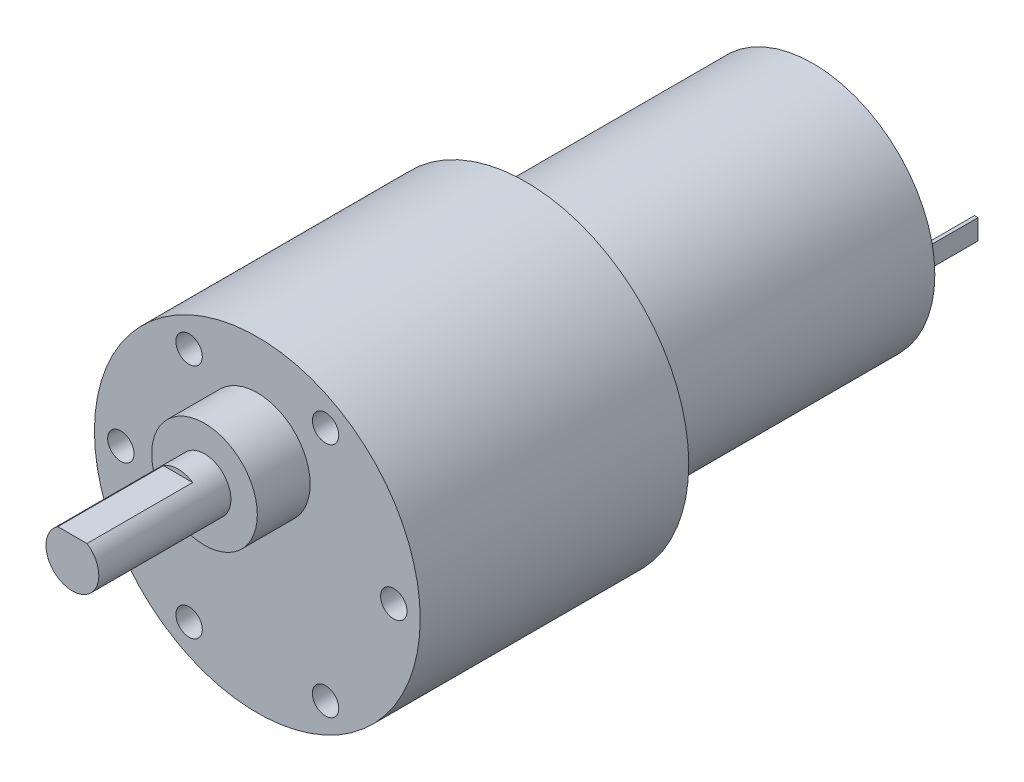
ISO-10303-21;
HEADER;
FILE_DESCRIPTION(('STEP AP214'),'2;1');
FILE_NAME('part.step','',(''),(''),'','','');
FILE_SCHEMA(('AUTOMOTIVE_DESIGN { 1 0 10303 214 1 1 1 1 }'));
ENDSEC;
DATA;
#1=APPLICATION_CONTEXT('core data for automotive mechanical design processes');
#2=APPLICATION_PROTOCOL_DEFINITION('international standard','automotive_design',2000,#1);
#3=PRODUCT_CONTEXT('',#1,'mechanical');
#4=PRODUCT('Part','Part','',(#3));
#5=PRODUCT_RELATED_PRODUCT_CATEGORY('part','',(#4));
#6=PRODUCT_DEFINITION_FORMATION('','',#4);
#7=PRODUCT_DEFINITION_CONTEXT('part definition',#1,'design');
#8=PRODUCT_DEFINITION('design','',#6,#7);
#9=PRODUCT_DEFINITION_SHAPE('','',#8);
#10=(LENGTH_UNIT() NAMED_UNIT(*) SI_UNIT(.MILLI.,.METRE.));
#11=(NAMED_UNIT(*) PLANE_ANGLE_UNIT() SI_UNIT($,.RADIAN.));
#12=(NAMED_UNIT(*) SI_UNIT($,.STERADIAN.) SOLID_ANGLE_UNIT());
#13=UNCERTAINTY_MEASURE_WITH_UNIT(LENGTH_MEASURE(1.E-05),#10,'distance_accuracy_value','');
#14=(GEOMETRIC_REPRESENTATION_CONTEXT(3) GLOBAL_UNCERTAINTY_ASSIGNED_CONTEXT((#13)) GLOBAL_UNIT_ASSIGNED_CONTEXT((#10,
#11,#12)) REPRESENTATION_CONTEXT('',''));
#15=CARTESIAN_POINT('',(0.,0.,0.));
#16=DIRECTION('',(0.,0.,1.));
#17=DIRECTION('',(1.,0.,0.));
#18=AXIS2_PLACEMENT_3D('',#15,#16,#17);
#19=CARTESIAN_POINT('',(0.,0.,0.));
#20=DIRECTION('',(0.,0.,1.));
#21=DIRECTION('',(1.,0.,0.));
#22=AXIS2_PLACEMENT_3D('',#19,#20,#21);
#23=PLANE('',#22);
#24=DIRECTION('',(0.,-1.,0.));
#25=VECTOR('',#24,1.);
#26=CARTESIAN_POINT('',(11.85,1.15,0.));
#27=LINE('',#26,#25);
#28=CARTESIAN_POINT('',(11.85,1.15,0.));
#29=VERTEX_POINT('',#28);
#30=CARTESIAN_POINT('',(11.85,-1.15,0.));
#31=VERTEX_POINT('',#30);
#32=EDGE_CURVE('E132',#29,#31,#27,.T.);
#33=ORIENTED_EDGE('',*,*,#32,.F.);
#34=DIRECTION('',(1.,0.,0.));
#35=VECTOR('',#34,1.);
#36=CARTESIAN_POINT('',(11.85,1.15,0.));
#37=LINE('',#36,#35);
#38=CARTESIAN_POINT('',(11.45,1.15,0.));
#39=VERTEX_POINT('',#38);
#40=EDGE_CURVE('E145',#39,#29,#37,.T.);
#41=ORIENTED_EDGE('',*,*,#40,.F.);
#42=DIRECTION('',(0.,1.,0.));
#43=VECTOR('',#42,1.);
#44=CARTESIAN_POINT('',(11.45,1.15,0.));
#45=LINE('',#44,#43);
#46=CARTESIAN_POINT('',(11.45,-1.15,0.));
#47=VERTEX_POINT('',#46);
#48=EDGE_CURVE('E154',#47,#39,#45,.T.);
#49=ORIENTED_EDGE('',*,*,#48,.F.);
#50=DIRECTION('',(-1.,0.,0.));
#51=VECTOR('',#50,1.);
#52=CARTESIAN_POINT('',(11.85,-1.15,0.));
#53=LINE('',#52,#51);
#54=EDGE_CURVE('E135',#31,#47,#53,.T.);
#55=ORIENTED_EDGE('',*,*,#54,.F.);
#56=EDGE_LOOP('',(#33,#41,#49,#55));
#57=FACE_BOUND('',#56,.T.);
#58=CARTESIAN_POINT('',(0.,0.,0.));
#59=DIRECTION('',(0.,0.,-1.));
#60=DIRECTION('',(-1.,0.,0.));
#61=AXIS2_PLACEMENT_3D('',#58,#59,#60);
#62=CIRCLE('',#61,5.);
#63=CARTESIAN_POINT('',(-5.,0.,0.));
#64=VERTEX_POINT('',#63);
#65=EDGE_CURVE('E42',#64,#64,#62,.T.);
#66=ORIENTED_EDGE('',*,*,#65,.F.);
#67=EDGE_LOOP('',(#66));
#68=FACE_BOUND('',#67,.T.);
#69=CARTESIAN_POINT('',(0.,0.,0.));
#70=DIRECTION('',(0.,0.,1.));
#71=DIRECTION('',(1.,0.,0.));
#72=AXIS2_PLACEMENT_3D('',#69,#70,#71);
#73=CIRCLE('',#72,13.85);
#74=CARTESIAN_POINT('',(13.85,0.,0.));
#75=VERTEX_POINT('',#74);
#76=EDGE_CURVE('E243',#75,#75,#73,.T.);
#77=ORIENTED_EDGE('',*,*,#76,.F.);
#78=EDGE_LOOP('',(#77));
#79=FACE_BOUND('',#78,.T.);
#80=DIRECTION('',(0.,1.,0.));
#81=VECTOR('',#80,1.);
#82=CARTESIAN_POINT('',(-11.85,1.15,0.));
#83=LINE('',#82,#81);
#84=CARTESIAN_POINT('',(-11.85,-1.15,0.));
#85=VERTEX_POINT('',#84);
#86=CARTESIAN_POINT('',(-11.85,1.15,0.));
#87=VERTEX_POINT('',#86);
#88=EDGE_CURVE('E131',#85,#87,#83,.T.);
#89=ORIENTED_EDGE('',*,*,#88,.F.);
#90=DIRECTION('',(-1.,0.,0.));
#91=VECTOR('',#90,1.);
#92=CARTESIAN_POINT('',(-11.85,-1.15,0.));
#93=LINE('',#92,#91);
#94=CARTESIAN_POINT('',(-11.45,-1.15,0.));
#95=VERTEX_POINT('',#94);
#96=EDGE_CURVE('E128',#95,#85,#93,.T.);
#97=ORIENTED_EDGE('',*,*,#96,.F.);
#98=DIRECTION('',(0.,-1.,0.));
#99=VECTOR('',#98,1.);
#100=CARTESIAN_POINT('',(-11.45,1.15,0.));
#101=LINE('',#100,#99);
#102=CARTESIAN_POINT('',(-11.45,1.15,0.));
#103=VERTEX_POINT('',#102);
#104=EDGE_CURVE('E54',#103,#95,#101,.T.);
#105=ORIENTED_EDGE('',*,*,#104,.F.);
#106=DIRECTION('',(1.,0.,0.));
#107=VECTOR('',#106,1.);
#108=CARTESIAN_POINT('',(-11.85,1.15,0.));
#109=LINE('',#108,#107);
#110=EDGE_CURVE('E49',#87,#103,#109,.T.);
#111=ORIENTED_EDGE('',*,*,#110,.F.);
#112=EDGE_LOOP('',(#89,#97,#105,#111));
#113=FACE_BOUND('',#112,.T.);
#114=ADVANCED_FACE('F34',(#57,#68,#79,#113),#23,.F.);
#115=CARTESIAN_POINT('',(0.,0.,32.6));
#116=DIRECTION('',(0.,0.,-1.));
#117=DIRECTION('',(-1.,0.,0.));
#118=AXIS2_PLACEMENT_3D('',#115,#116,#117);
#119=CYLINDRICAL_SURFACE('',#118,13.85);
#120=CARTESIAN_POINT('',(0.,0.,32.6));
#121=DIRECTION('',(0.,0.,1.));
#122=DIRECTION('',(1.,0.,0.));
#123=AXIS2_PLACEMENT_3D('',#120,#121,#122);
#124=CIRCLE('',#123,13.85);
#125=CARTESIAN_POINT('',(13.85,0.,32.6));
#126=VERTEX_POINT('',#125);
#127=EDGE_CURVE('E233',#126,#126,#124,.T.);
#128=ORIENTED_EDGE('',*,*,#127,.F.);
#129=EDGE_LOOP('',(#128));
#130=FACE_BOUND('',#129,.T.);
#131=ORIENTED_EDGE('',*,*,#76,.T.);
#132=EDGE_LOOP('',(#131));
#133=FACE_BOUND('',#132,.T.);
#134=ADVANCED_FACE('F36',(#130,#133),#119,.T.);
#135=CARTESIAN_POINT('',(0.,0.,63.1));
#136=DIRECTION('',(0.,0.,-1.));
#137=DIRECTION('',(-1.,0.,0.));
#138=AXIS2_PLACEMENT_3D('',#135,#136,#137);
#139=CYLINDRICAL_SURFACE('',#138,18.5);
#140=CARTESIAN_POINT('',(0.,0.,63.1));
#141=DIRECTION('',(0.,0.,1.));
#142=DIRECTION('',(1.,0.,0.));
#143=AXIS2_PLACEMENT_3D('',#140,#141,#142);
#144=CIRCLE('',#143,18.5);
#145=CARTESIAN_POINT('',(-18.5,0.,63.1));
#146=VERTEX_POINT('',#145);
#147=EDGE_CURVE('E240',#146,#146,#144,.T.);
#148=CARTESIAN_POINT('',(0.,0.,32.6));
#149=DIRECTION('',(0.,0.,1.));
#150=DIRECTION('',(1.,0.,0.));
#151=AXIS2_PLACEMENT_3D('',#148,#149,#150);
#152=CIRCLE('',#151,18.5);
#153=CARTESIAN_POINT('',(-18.5,0.,32.6));
#154=VERTEX_POINT('',#153);
#155=EDGE_CURVE('E237',#154,#154,#152,.T.);
#156=CARTESIAN_POINT('',(-18.5,0.,63.1));
#157=CARTESIAN_POINT('',(-18.5,0.,62.7822916666667));
#158=CARTESIAN_POINT('',(-18.5,0.,62.4645833333333));
#159=CARTESIAN_POINT('',(-18.5,0.,61.8291666666667));
#160=CARTESIAN_POINT('',(-18.5,0.,61.5114583333333));
#161=CARTESIAN_POINT('',(-18.5,0.,60.8760416666667));
#162=CARTESIAN_POINT('',(-18.5,0.,60.5583333333333));
#163=CARTESIAN_POINT('',(-18.5,0.,59.9229166666667));
#164=CARTESIAN_POINT('',(-18.5,0.,59.6052083333333));
#165=CARTESIAN_POINT('',(-18.5,0.,58.9697916666667));
#166=CARTESIAN_POINT('',(-18.5,0.,58.6520833333333));
#167=CARTESIAN_POINT('',(-18.5,0.,58.0166666666667));
#168=CARTESIAN_POINT('',(-18.5,0.,57.6989583333333));
#169=CARTESIAN_POINT('',(-18.5,0.,57.0635416666667));
#170=CARTESIAN_POINT('',(-18.5,0.,56.7458333333333));
#171=CARTESIAN_POINT('',(-18.5,0.,56.1104166666667));
#172=CARTESIAN_POINT('',(-18.5,0.,55.7927083333333));
#173=CARTESIAN_POINT('',(-18.5,0.,55.1572916666667));
#174=CARTESIAN_POINT('',(-18.5,0.,54.8395833333333));
#175=CARTESIAN_POINT('',(-18.5,0.,54.2041666666667));
#176=CARTESIAN_POINT('',(-18.5,0.,53.8864583333333));
#177=CARTESIAN_POINT('',(-18.5,0.,53.2510416666667));
#178=CARTESIAN_POINT('',(-18.5,0.,52.9333333333333));
#179=CARTESIAN_POINT('',(-18.5,0.,52.2979166666667));
#180=CARTESIAN_POINT('',(-18.5,0.,51.9802083333333));
#181=CARTESIAN_POINT('',(-18.5,0.,51.3447916666667));
#182=CARTESIAN_POINT('',(-18.5,0.,51.0270833333333));
#183=CARTESIAN_POINT('',(-18.5,0.,50.3916666666667));
#184=CARTESIAN_POINT('',(-18.5,0.,50.0739583333333));
#185=CARTESIAN_POINT('',(-18.5,0.,49.4385416666667));
#186=CARTESIAN_POINT('',(-18.5,0.,49.1208333333333));
#187=CARTESIAN_POINT('',(-18.5,0.,48.4854166666667));
#188=CARTESIAN_POINT('',(-18.5,0.,48.1677083333333));
#189=CARTESIAN_POINT('',(-18.5,0.,47.5322916666667));
#190=CARTESIAN_POINT('',(-18.5,0.,47.2145833333333));
#191=CARTESIAN_POINT('',(-18.5,0.,46.5791666666667));
#192=CARTESIAN_POINT('',(-18.5,0.,46.2614583333333));
#193=CARTESIAN_POINT('',(-18.5,0.,45.6260416666667));
#194=CARTESIAN_POINT('',(-18.5,0.,45.3083333333333));
#195=CARTESIAN_POINT('',(-18.5,0.,44.6729166666667));
#196=CARTESIAN_POINT('',(-18.5,0.,44.3552083333333));
#197=CARTESIAN_POINT('',(-18.5,0.,43.7197916666667));
#198=CARTESIAN_POINT('',(-18.5,0.,43.4020833333333));
#199=CARTESIAN_POINT('',(-18.5,0.,42.7666666666667));
#200=CARTESIAN_POINT('',(-18.5,0.,42.4489583333333));
#201=CARTESIAN_POINT('',(-18.5,0.,41.8135416666667));
#202=CARTESIAN_POINT('',(-18.5,0.,41.4958333333333));
#203=CARTESIAN_POINT('',(-18.5,0.,40.8604166666667));
#204=CARTESIAN_POINT('',(-18.5,0.,40.5427083333333));
#205=CARTESIAN_POINT('',(-18.5,0.,39.9072916666667));
#206=CARTESIAN_POINT('',(-18.5,0.,39.5895833333333));
#207=CARTESIAN_POINT('',(-18.5,0.,38.9541666666667));
#208=CARTESIAN_POINT('',(-18.5,0.,38.6364583333333));
#209=CARTESIAN_POINT('',(-18.5,0.,38.0010416666667));
#210=CARTESIAN_POINT('',(-18.5,0.,37.6833333333333));
#211=CARTESIAN_POINT('',(-18.5,0.,37.0479166666667));
#212=CARTESIAN_POINT('',(-18.5,0.,36.7302083333333));
#213=CARTESIAN_POINT('',(-18.5,0.,36.0947916666667));
#214=CARTESIAN_POINT('',(-18.5,0.,35.7770833333333));
#215=CARTESIAN_POINT('',(-18.5,0.,35.1416666666667));
#216=CARTESIAN_POINT('',(-18.5,0.,34.8239583333333));
#217=CARTESIAN_POINT('',(-18.5,0.,34.1885416666667));
#218=CARTESIAN_POINT('',(-18.5,0.,33.8708333333333));
#219=CARTESIAN_POINT('',(-18.5,0.,33.2354166666667));
#220=CARTESIAN_POINT('',(-18.5,0.,32.9177083333333));
#221=CARTESIAN_POINT('',(-18.5,0.,32.6));
#222=B_SPLINE_CURVE_WITH_KNOTS('',3,(#156,#157,#158,#159,#160,#161,#162,#163,#164,#165,#166,
#167,#168,#169,#170,#171,#172,#173,#174,#175,#176,#177,#178,#179,#180,#181,#182,#183,#184,#185,
#186,#187,#188,#189,#190,#191,#192,#193,#194,#195,#196,#197,#198,#199,#200,#201,#202,#203,#204,
#205,#206,#207,#208,#209,#210,#211,#212,#213,#214,#215,#216,#217,#218,#219,#220,#221),
.UNSPECIFIED.,.F.,.F.,(4,2,2,2,2,2,2,2,2,2,2,2,2,2,2,2,2,2,2,2,2,2,2,2,2,2,2,2,2,2,2,2,4),(0.,
0.953125000000006,1.90625000000001,2.859375,3.8125,4.76562500000001,5.71875000000001,
6.67187500000001,7.62500000000001,8.57812500000001,9.53125000000001,10.484375,11.4375,12.390625,
13.34375,14.296875,15.25,16.203125,17.15625,18.109375,19.0625,20.015625,20.96875,21.921875,
22.875,23.828125,24.78125,25.734375,26.6875,27.640625,28.59375,29.546875,30.5),.UNSPECIFIED.);
#223=EDGE_CURVE('BSEAM392',#146,#154,#222,.T.);
#224=ORIENTED_EDGE('',*,*,#147,.F.);
#225=ORIENTED_EDGE('',*,*,#155,.T.);
#226=ORIENTED_EDGE('',*,*,#223,.T.);
#227=ORIENTED_EDGE('',*,*,#223,.F.);
#228=EDGE_LOOP('',(#224,#226,#225,#227));
#229=FACE_BOUND('',#228,.T.);
#230=ADVANCED_FACE('F392',(#229),#139,.T.);
#231=CARTESIAN_POINT('',(0.,0.,63.1));
#232=DIRECTION('',(0.,0.,1.));
#233=DIRECTION('',(1.,0.,0.));
#234=AXIS2_PLACEMENT_3D('',#231,#232,#233);
#235=PLANE('',#234);
#236=CARTESIAN_POINT('',(-15.5,0.,63.1));
#237=DIRECTION('',(0.,0.,1.));
#238=DIRECTION('',(1.,0.,0.));
#239=AXIS2_PLACEMENT_3D('',#236,#237,#238);
#240=CIRCLE('',#239,1.5);
#241=CARTESIAN_POINT('',(-14.,0.,63.1));
#242=VERTEX_POINT('',#241);
#243=EDGE_CURVE('E184',#242,#242,#240,.T.);
#244=ORIENTED_EDGE('',*,*,#243,.F.);
#245=EDGE_LOOP('',(#244));
#246=FACE_BOUND('',#245,.T.);
#247=CARTESIAN_POINT('',(-7.74999999999999,-13.4233937586588,63.1));
#248=DIRECTION('',(0.,0.,1.));
#249=DIRECTION('',(1.,0.,0.));
#250=AXIS2_PLACEMENT_3D('',#247,#248,#249);
#251=CIRCLE('',#250,1.5);
#252=CARTESIAN_POINT('',(-6.24999999999999,-13.4233937586588,63.1));
#253=VERTEX_POINT('',#252);
#254=EDGE_CURVE('E176',#253,#253,#251,.T.);
#255=ORIENTED_EDGE('',*,*,#254,.F.);
#256=EDGE_LOOP('',(#255));
#257=FACE_BOUND('',#256,.T.);
#258=CARTESIAN_POINT('',(7.75000000000001,-13.4233937586588,63.1));
#259=DIRECTION('',(0.,0.,1.));
#260=DIRECTION('',(1.,0.,0.));
#261=AXIS2_PLACEMENT_3D('',#258,#259,#260);
#262=CIRCLE('',#261,1.5);
#263=CARTESIAN_POINT('',(9.25000000000001,-13.4233937586588,63.1));
#264=VERTEX_POINT('',#263);
#265=EDGE_CURVE('E191',#264,#264,#262,.T.);
#266=ORIENTED_EDGE('',*,*,#265,.F.);
#267=EDGE_LOOP('',(#266));
#268=FACE_BOUND('',#267,.T.);
#269=CARTESIAN_POINT('',(15.5,0.,63.1));
#270=DIRECTION('',(0.,0.,1.));
#271=DIRECTION('',(1.,0.,0.));
#272=AXIS2_PLACEMENT_3D('',#269,#270,#271);
#273=CIRCLE('',#272,1.5);
#274=CARTESIAN_POINT('',(17.,0.,63.1));
#275=VERTEX_POINT('',#274);
#276=EDGE_CURVE('E208',#275,#275,#273,.T.);
#277=ORIENTED_EDGE('',*,*,#276,.F.);
#278=EDGE_LOOP('',(#277));
#279=FACE_BOUND('',#278,.T.);
#280=CARTESIAN_POINT('',(7.75,13.4233937586588,63.1));
#281=DIRECTION('',(0.,0.,1.));
#282=DIRECTION('',(1.,0.,0.));
#283=AXIS2_PLACEMENT_3D('',#280,#281,#282);
#284=CIRCLE('',#283,1.5);
#285=CARTESIAN_POINT('',(9.25,13.4233937586588,63.1));
#286=VERTEX_POINT('',#285);
#287=EDGE_CURVE('E202',#286,#286,#284,.T.);
#288=ORIENTED_EDGE('',*,*,#287,.F.);
#289=EDGE_LOOP('',(#288));
#290=FACE_BOUND('',#289,.T.);
#291=CARTESIAN_POINT('',(-7.75,13.4233937586588,63.1));
#292=DIRECTION('',(0.,0.,1.));
#293=DIRECTION('',(1.,0.,0.));
#294=AXIS2_PLACEMENT_3D('',#291,#292,#293);
#295=CIRCLE('',#294,1.5);
#296=CARTESIAN_POINT('',(-6.25,13.4233937586588,63.1));
#297=VERTEX_POINT('',#296);
#298=EDGE_CURVE('E196',#297,#297,#295,.T.);
#299=ORIENTED_EDGE('',*,*,#298,.F.);
#300=EDGE_LOOP('',(#299));
#301=FACE_BOUND('',#300,.T.);
#302=CARTESIAN_POINT('',(0.,7.,63.1));
#303=DIRECTION('',(0.,0.,1.));
#304=DIRECTION('',(1.,0.,0.));
#305=AXIS2_PLACEMENT_3D('',#302,#303,#304);
#306=CIRCLE('',#305,6.);
#307=CARTESIAN_POINT('',(6.,7.,63.1));
#308=VERTEX_POINT('',#307);
#309=EDGE_CURVE('E230',#308,#308,#306,.T.);
#310=ORIENTED_EDGE('',*,*,#309,.F.);
#311=EDGE_LOOP('',(#310));
#312=FACE_BOUND('',#311,.T.);
#313=ORIENTED_EDGE('',*,*,#147,.T.);
#314=EDGE_LOOP('',(#313));
#315=FACE_BOUND('',#314,.T.);
#316=ADVANCED_FACE('F389',(#246,#257,#268,#279,#290,#301,#312,#315),#235,.T.);
#317=CARTESIAN_POINT('',(0.,0.,32.6));
#318=DIRECTION('',(0.,0.,1.));
#319=DIRECTION('',(1.,0.,0.));
#320=AXIS2_PLACEMENT_3D('',#317,#318,#319);
#321=PLANE('',#320);
#322=ORIENTED_EDGE('',*,*,#127,.T.);
#323=EDGE_LOOP('',(#322));
#324=FACE_BOUND('',#323,.T.);
#325=ORIENTED_EDGE('',*,*,#155,.F.);
#326=EDGE_LOOP('',(#325));
#327=FACE_BOUND('',#326,.T.);
#328=ADVANCED_FACE('F387',(#324,#327),#321,.F.);
#329=CARTESIAN_POINT('',(0.,7.,69.1));
#330=DIRECTION('',(0.,0.,-1.));
#331=DIRECTION('',(-1.,0.,0.));
#332=AXIS2_PLACEMENT_3D('',#329,#330,#331);
#333=CYLINDRICAL_SURFACE('',#332,6.);
#334=CARTESIAN_POINT('',(0.,7.,69.1));
#335=DIRECTION('',(0.,0.,1.));
#336=DIRECTION('',(1.,0.,0.));
#337=AXIS2_PLACEMENT_3D('',#334,#335,#336);
#338=CIRCLE('',#337,6.);
#339=CARTESIAN_POINT('',(6.,7.,69.1));
#340=VERTEX_POINT('',#339);
#341=EDGE_CURVE('E234',#340,#340,#338,.T.);
#342=ORIENTED_EDGE('',*,*,#341,.F.);
#343=EDGE_LOOP('',(#342));
#344=FACE_BOUND('',#343,.T.);
#345=ORIENTED_EDGE('',*,*,#309,.T.);
#346=EDGE_LOOP('',(#345));
#347=FACE_BOUND('',#346,.T.);
#348=ADVANCED_FACE('F383',(#344,#347),#333,.T.);
#349=CARTESIAN_POINT('',(0.,7.,69.1));
#350=DIRECTION('',(0.,0.,1.));
#351=DIRECTION('',(1.,0.,0.));
#352=AXIS2_PLACEMENT_3D('',#349,#350,#351);
#353=PLANE('',#352);
#354=CARTESIAN_POINT('',(0.,7.,69.1));
#355=DIRECTION('',(0.,0.,1.));
#356=DIRECTION('',(1.,0.,0.));
#357=AXIS2_PLACEMENT_3D('',#354,#355,#356);
#358=CIRCLE('',#357,3.);
#359=CARTESIAN_POINT('',(3.,7.,69.1));
#360=VERTEX_POINT('',#359);
#361=EDGE_CURVE('E179',#360,#360,#358,.T.);
#362=ORIENTED_EDGE('',*,*,#361,.F.);
#363=EDGE_LOOP('',(#362));
#364=FACE_BOUND('',#363,.T.);
#365=ORIENTED_EDGE('',*,*,#341,.T.);
#366=EDGE_LOOP('',(#365));
#367=FACE_BOUND('',#366,.T.);
#368=ADVANCED_FACE('F379',(#364,#367),#353,.T.);
#369=CARTESIAN_POINT('',(0.,7.,84.1));
#370=DIRECTION('',(0.,0.,-1.));
#371=DIRECTION('',(-1.,0.,0.));
#372=AXIS2_PLACEMENT_3D('',#369,#370,#371);
#373=CYLINDRICAL_SURFACE('',#372,3.);
#374=CARTESIAN_POINT('',(0.,7.,84.1));
#375=DIRECTION('',(0.,0.,1.));
#376=DIRECTION('',(1.,0.,0.));
#377=AXIS2_PLACEMENT_3D('',#374,#375,#376);
#378=CIRCLE('',#377,3.);
#379=CARTESIAN_POINT('',(-1.6583123951777,9.5,84.1));
#380=VERTEX_POINT('',#379);
#381=CARTESIAN_POINT('',(1.6583123951777,9.5,84.1));
#382=VERTEX_POINT('',#381);
#383=EDGE_CURVE('E226',#380,#382,#378,.T.);
#384=ORIENTED_EDGE('',*,*,#383,.F.);
#385=DIRECTION('',(0.,0.,1.));
#386=VECTOR('',#385,1.);
#387=CARTESIAN_POINT('',(-1.6583123951777,9.5,72.1));
#388=LINE('',#387,#386);
#389=CARTESIAN_POINT('',(-1.6583123951777,9.5,72.1));
#390=VERTEX_POINT('',#389);
#391=EDGE_CURVE('E221',#390,#380,#388,.T.);
#392=ORIENTED_EDGE('',*,*,#391,.F.);
#393=CARTESIAN_POINT('',(0.,7.,72.1));
#394=DIRECTION('',(0.,0.,1.));
#395=DIRECTION('',(-1.,0.,0.));
#396=AXIS2_PLACEMENT_3D('',#393,#394,#395);
#397=CIRCLE('',#396,3.);
#398=CARTESIAN_POINT('',(1.6583123951777,9.5,72.1));
#399=VERTEX_POINT('',#398);
#400=EDGE_CURVE('E216',#399,#390,#397,.T.);
#401=ORIENTED_EDGE('',*,*,#400,.F.);
#402=DIRECTION('',(0.,0.,1.));
#403=VECTOR('',#402,1.);
#404=CARTESIAN_POINT('',(1.6583123951777,9.5,72.1));
#405=LINE('',#404,#403);
#406=EDGE_CURVE('E223',#399,#382,#405,.T.);
#407=ORIENTED_EDGE('',*,*,#406,.T.);
#408=EDGE_LOOP('',(#384,#392,#401,#407));
#409=FACE_BOUND('',#408,.T.);
#410=ORIENTED_EDGE('',*,*,#361,.T.);
#411=EDGE_LOOP('',(#410));
#412=FACE_BOUND('',#411,.T.);
#413=ADVANCED_FACE('F375',(#409,#412),#373,.T.);
#414=CARTESIAN_POINT('',(0.,7.,84.1));
#415=DIRECTION('',(0.,0.,1.));
#416=DIRECTION('',(1.,0.,0.));
#417=AXIS2_PLACEMENT_3D('',#414,#415,#416);
#418=PLANE('',#417);
#419=DIRECTION('',(1.,0.,0.));
#420=VECTOR('',#419,1.);
#421=CARTESIAN_POINT('',(-1.6583123951777,9.5,84.1));
#422=LINE('',#421,#420);
#423=EDGE_CURVE('E183',#380,#382,#422,.T.);
#424=ORIENTED_EDGE('',*,*,#423,.F.);
#425=ORIENTED_EDGE('',*,*,#383,.T.);
#426=EDGE_LOOP('',(#424,#425));
#427=FACE_BOUND('',#426,.T.);
#428=ADVANCED_FACE('F371',(#427),#418,.T.);
#429=CARTESIAN_POINT('',(-1.6583123951777,9.5,72.1));
#430=DIRECTION('',(0.,-1.,0.));
#431=DIRECTION('',(0.,0.,-1.));
#432=AXIS2_PLACEMENT_3D('',#429,#430,#431);
#433=PLANE('',#432);
#434=ORIENTED_EDGE('',*,*,#423,.T.);
#435=ORIENTED_EDGE('',*,*,#406,.F.);
#436=DIRECTION('',(1.,0.,0.));
#437=VECTOR('',#436,1.);
#438=CARTESIAN_POINT('',(-1.6583123951777,9.5,72.1));
#439=LINE('',#438,#437);
#440=EDGE_CURVE('E218',#390,#399,#439,.T.);
#441=ORIENTED_EDGE('',*,*,#440,.F.);
#442=ORIENTED_EDGE('',*,*,#391,.T.);
#443=EDGE_LOOP('',(#434,#435,#441,#442));
#444=FACE_BOUND('',#443,.T.);
#445=ADVANCED_FACE('F367',(#444),#433,.F.);
#446=CARTESIAN_POINT('',(0.,7.,72.1));
#447=DIRECTION('',(0.,0.,-1.));
#448=DIRECTION('',(-1.,0.,0.));
#449=AXIS2_PLACEMENT_3D('',#446,#447,#448);
#450=PLANE('',#449);
#451=ORIENTED_EDGE('',*,*,#400,.T.);
#452=ORIENTED_EDGE('',*,*,#440,.T.);
#453=EDGE_LOOP('',(#451,#452));
#454=FACE_BOUND('',#453,.T.);
#455=ADVANCED_FACE('F341',(#454),#450,.F.);
#456=CARTESIAN_POINT('',(-7.75,13.4233937586588,59.6));
#457=DIRECTION('',(0.,0.,1.));
#458=DIRECTION('',(1.,0.,0.));
#459=AXIS2_PLACEMENT_3D('',#456,#457,#458);
#460=CYLINDRICAL_SURFACE('',#459,1.5);
#461=CARTESIAN_POINT('',(-7.75,13.4233937586588,59.6));
#462=DIRECTION('',(0.,0.,1.));
#463=DIRECTION('',(1.,0.,0.));
#464=AXIS2_PLACEMENT_3D('',#461,#462,#463);
#465=CIRCLE('',#464,1.5);
#466=CARTESIAN_POINT('',(-6.25,13.4233937586588,59.6));
#467=VERTEX_POINT('',#466);
#468=EDGE_CURVE('E187',#467,#467,#465,.T.);
#469=ORIENTED_EDGE('',*,*,#468,.F.);
#470=EDGE_LOOP('',(#469));
#471=FACE_BOUND('',#470,.T.);
#472=ORIENTED_EDGE('',*,*,#298,.T.);
#473=EDGE_LOOP('',(#472));
#474=FACE_BOUND('',#473,.T.);
#475=ADVANCED_FACE('F337',(#471,#474),#460,.F.);
#476=CARTESIAN_POINT('',(-7.75,13.4233937586588,59.6));
#477=DIRECTION('',(0.,0.,1.));
#478=DIRECTION('',(1.,0.,0.));
#479=AXIS2_PLACEMENT_3D('',#476,#477,#478);
#480=PLANE('',#479);
#481=ORIENTED_EDGE('',*,*,#468,.T.);
#482=EDGE_LOOP('',(#481));
#483=FACE_BOUND('',#482,.T.);
#484=ADVANCED_FACE('F333',(#483),#480,.T.);
#485=CARTESIAN_POINT('',(7.75,13.4233937586588,59.6));
#486=DIRECTION('',(0.,0.,1.));
#487=DIRECTION('',(1.,0.,0.));
#488=AXIS2_PLACEMENT_3D('',#485,#486,#487);
#489=CYLINDRICAL_SURFACE('',#488,1.5);
#490=CARTESIAN_POINT('',(7.75,13.4233937586588,59.6));
#491=DIRECTION('',(0.,0.,1.));
#492=DIRECTION('',(1.,0.,0.));
#493=AXIS2_PLACEMENT_3D('',#490,#491,#492);
#494=CIRCLE('',#493,1.5);
#495=CARTESIAN_POINT('',(9.25,13.4233937586588,59.6));
#496=VERTEX_POINT('',#495);
#497=EDGE_CURVE('E199',#496,#496,#494,.T.);
#498=ORIENTED_EDGE('',*,*,#497,.F.);
#499=EDGE_LOOP('',(#498));
#500=FACE_BOUND('',#499,.T.);
#501=ORIENTED_EDGE('',*,*,#287,.T.);
#502=EDGE_LOOP('',(#501));
#503=FACE_BOUND('',#502,.T.);
#504=ADVANCED_FACE('F336',(#500,#503),#489,.F.);
#505=CARTESIAN_POINT('',(7.75,13.4233937586588,59.6));
#506=DIRECTION('',(0.,0.,1.));
#507=DIRECTION('',(1.,0.,0.));
#508=AXIS2_PLACEMENT_3D('',#505,#506,#507);
#509=PLANE('',#508);
#510=ORIENTED_EDGE('',*,*,#497,.T.);
#511=EDGE_LOOP('',(#510));
#512=FACE_BOUND('',#511,.T.);
#513=ADVANCED_FACE('F343',(#512),#509,.T.);
#514=CARTESIAN_POINT('',(15.5,0.,59.6));
#515=DIRECTION('',(0.,0.,1.));
#516=DIRECTION('',(1.,0.,0.));
#517=AXIS2_PLACEMENT_3D('',#514,#515,#516);
#518=CYLINDRICAL_SURFACE('',#517,1.5);
#519=CARTESIAN_POINT('',(15.5,0.,59.6));
#520=DIRECTION('',(0.,0.,1.));
#521=DIRECTION('',(1.,0.,0.));
#522=AXIS2_PLACEMENT_3D('',#519,#520,#521);
#523=CIRCLE('',#522,1.5);
#524=CARTESIAN_POINT('',(17.,0.,59.6));
#525=VERTEX_POINT('',#524);
#526=EDGE_CURVE('E205',#525,#525,#523,.T.);
#527=ORIENTED_EDGE('',*,*,#526,.F.);
#528=EDGE_LOOP('',(#527));
#529=FACE_BOUND('',#528,.T.);
#530=ORIENTED_EDGE('',*,*,#276,.T.);
#531=EDGE_LOOP('',(#530));
#532=FACE_BOUND('',#531,.T.);
#533=ADVANCED_FACE('F346',(#529,#532),#518,.F.);
#534=CARTESIAN_POINT('',(15.5,0.,59.6));
#535=DIRECTION('',(0.,0.,1.));
#536=DIRECTION('',(1.,0.,0.));
#537=AXIS2_PLACEMENT_3D('',#534,#535,#536);
#538=PLANE('',#537);
#539=ORIENTED_EDGE('',*,*,#526,.T.);
#540=EDGE_LOOP('',(#539));
#541=FACE_BOUND('',#540,.T.);
#542=ADVANCED_FACE('F351',(#541),#538,.T.);
#543=CARTESIAN_POINT('',(7.75000000000001,-13.4233937586588,59.6));
#544=DIRECTION('',(0.,0.,1.));
#545=DIRECTION('',(1.,0.,0.));
#546=AXIS2_PLACEMENT_3D('',#543,#544,#545);
#547=CYLINDRICAL_SURFACE('',#546,1.5);
#548=CARTESIAN_POINT('',(7.75000000000001,-13.4233937586588,59.6));
#549=DIRECTION('',(0.,0.,1.));
#550=DIRECTION('',(1.,0.,0.));
#551=AXIS2_PLACEMENT_3D('',#548,#549,#550);
#552=CIRCLE('',#551,1.5);
#553=CARTESIAN_POINT('',(9.25000000000001,-13.4233937586588,59.6));
#554=VERTEX_POINT('',#553);
#555=EDGE_CURVE('E211',#554,#554,#552,.T.);
#556=ORIENTED_EDGE('',*,*,#555,.F.);
#557=EDGE_LOOP('',(#556));
#558=FACE_BOUND('',#557,.T.);
#559=ORIENTED_EDGE('',*,*,#265,.T.);
#560=EDGE_LOOP('',(#559));
#561=FACE_BOUND('',#560,.T.);
#562=ADVANCED_FACE('F354',(#558,#561),#547,.F.);
#563=CARTESIAN_POINT('',(7.75000000000001,-13.4233937586588,59.6));
#564=DIRECTION('',(0.,0.,1.));
#565=DIRECTION('',(1.,0.,0.));
#566=AXIS2_PLACEMENT_3D('',#563,#564,#565);
#567=PLANE('',#566);
#568=ORIENTED_EDGE('',*,*,#555,.T.);
#569=EDGE_LOOP('',(#568));
#570=FACE_BOUND('',#569,.T.);
#571=ADVANCED_FACE('F331',(#570),#567,.T.);
#572=CARTESIAN_POINT('',(-7.74999999999999,-13.4233937586588,59.6));
#573=DIRECTION('',(0.,0.,1.));
#574=DIRECTION('',(1.,0.,0.));
#575=AXIS2_PLACEMENT_3D('',#572,#573,#574);
#576=CYLINDRICAL_SURFACE('',#575,1.5);
#577=CARTESIAN_POINT('',(-7.74999999999999,-13.4233937586588,59.6));
#578=DIRECTION('',(0.,0.,1.));
#579=DIRECTION('',(1.,0.,0.));
#580=AXIS2_PLACEMENT_3D('',#577,#578,#579);
#581=CIRCLE('',#580,1.5);
#582=CARTESIAN_POINT('',(-6.24999999999999,-13.4233937586588,59.6));
#583=VERTEX_POINT('',#582);
#584=EDGE_CURVE('E188',#583,#583,#581,.T.);
#585=ORIENTED_EDGE('',*,*,#584,.F.);
#586=EDGE_LOOP('',(#585));
#587=FACE_BOUND('',#586,.T.);
#588=ORIENTED_EDGE('',*,*,#254,.T.);
#589=EDGE_LOOP('',(#588));
#590=FACE_BOUND('',#589,.T.);
#591=ADVANCED_FACE('F327',(#587,#590),#576,.F.);
#592=CARTESIAN_POINT('',(-7.74999999999999,-13.4233937586588,59.6));
#593=DIRECTION('',(0.,0.,1.));
#594=DIRECTION('',(1.,0.,0.));
#595=AXIS2_PLACEMENT_3D('',#592,#593,#594);
#596=PLANE('',#595);
#597=ORIENTED_EDGE('',*,*,#584,.T.);
#598=EDGE_LOOP('',(#597));
#599=FACE_BOUND('',#598,.T.);
#600=ADVANCED_FACE('F323',(#599),#596,.T.);
#601=CARTESIAN_POINT('',(-15.5,0.,59.6));
#602=DIRECTION('',(0.,0.,1.));
#603=DIRECTION('',(1.,0.,0.));
#604=AXIS2_PLACEMENT_3D('',#601,#602,#603);
#605=CYLINDRICAL_SURFACE('',#604,1.5);
#606=CARTESIAN_POINT('',(-15.5,0.,59.6));
#607=DIRECTION('',(0.,0.,1.));
#608=DIRECTION('',(1.,0.,0.));
#609=AXIS2_PLACEMENT_3D('',#606,#607,#608);
#610=CIRCLE('',#609,1.5);
#611=CARTESIAN_POINT('',(-14.,0.,59.6));
#612=VERTEX_POINT('',#611);
#613=EDGE_CURVE('E180',#612,#612,#610,.T.);
#614=ORIENTED_EDGE('',*,*,#613,.F.);
#615=EDGE_LOOP('',(#614));
#616=FACE_BOUND('',#615,.T.);
#617=ORIENTED_EDGE('',*,*,#243,.T.);
#618=EDGE_LOOP('',(#617));
#619=FACE_BOUND('',#618,.T.);
#620=ADVANCED_FACE('F319',(#616,#619),#605,.F.);
#621=CARTESIAN_POINT('',(-15.5,0.,59.6));
#622=DIRECTION('',(0.,0.,1.));
#623=DIRECTION('',(1.,0.,0.));
#624=AXIS2_PLACEMENT_3D('',#621,#622,#623);
#625=PLANE('',#624);
#626=ORIENTED_EDGE('',*,*,#613,.T.);
#627=EDGE_LOOP('',(#626));
#628=FACE_BOUND('',#627,.T.);
#629=ADVANCED_FACE('F315',(#628),#625,.T.);
#630=CARTESIAN_POINT('',(0.,0.,-2.6));
#631=DIRECTION('',(0.,0.,1.));
#632=DIRECTION('',(1.,0.,0.));
#633=AXIS2_PLACEMENT_3D('',#630,#631,#632);
#634=CYLINDRICAL_SURFACE('',#633,5.);
#635=CARTESIAN_POINT('',(0.,0.,-2.6));
#636=DIRECTION('',(0.,0.,-1.));
#637=DIRECTION('',(-1.,0.,0.));
#638=AXIS2_PLACEMENT_3D('',#635,#636,#637);
#639=CIRCLE('',#638,5.);
#640=CARTESIAN_POINT('',(-5.,0.,-2.6));
#641=VERTEX_POINT('',#640);
#642=EDGE_CURVE('E173',#641,#641,#639,.T.);
#643=ORIENTED_EDGE('',*,*,#642,.F.);
#644=EDGE_LOOP('',(#643));
#645=FACE_BOUND('',#644,.T.);
#646=ORIENTED_EDGE('',*,*,#65,.T.);
#647=EDGE_LOOP('',(#646));
#648=FACE_BOUND('',#647,.T.);
#649=ADVANCED_FACE('F311',(#645,#648),#634,.T.);
#650=CARTESIAN_POINT('',(0.,0.,-2.6));
#651=DIRECTION('',(0.,0.,-1.));
#652=DIRECTION('',(-1.,0.,0.));
#653=AXIS2_PLACEMENT_3D('',#650,#651,#652);
#654=PLANE('',#653);
#655=CARTESIAN_POINT('',(0.,0.,-2.6));
#656=DIRECTION('',(0.,0.,-1.));
#657=DIRECTION('',(-1.,0.,0.));
#658=AXIS2_PLACEMENT_3D('',#655,#656,#657);
#659=CIRCLE('',#658,1.15);
#660=CARTESIAN_POINT('',(-1.15,0.,-2.6));
#661=VERTEX_POINT('',#660);
#662=EDGE_CURVE('E11',#661,#661,#659,.T.);
#663=ORIENTED_EDGE('',*,*,#662,.F.);
#664=EDGE_LOOP('',(#663));
#665=FACE_BOUND('',#664,.T.);
#666=ORIENTED_EDGE('',*,*,#642,.T.);
#667=EDGE_LOOP('',(#666));
#668=FACE_BOUND('',#667,.T.);
#669=ADVANCED_FACE('F307',(#665,#668),#654,.T.);
#670=CARTESIAN_POINT('',(0.,0.,-8.5));
#671=DIRECTION('',(0.,0.,1.));
#672=DIRECTION('',(1.,0.,0.));
#673=AXIS2_PLACEMENT_3D('',#670,#671,#672);
#674=CYLINDRICAL_SURFACE('',#673,1.15);
#675=ORIENTED_EDGE('',*,*,#662,.T.);
#676=EDGE_LOOP('',(#675));
#677=FACE_BOUND('',#676,.T.);
#678=CARTESIAN_POINT('',(0.,0.,-8.5));
#679=DIRECTION('',(0.,0.,1.));
#680=DIRECTION('',(1.,0.,0.));
#681=AXIS2_PLACEMENT_3D('',#678,#679,#680);
#682=CIRCLE('',#681,1.15);
#683=CARTESIAN_POINT('',(1.15,0.,-8.5));
#684=VERTEX_POINT('',#683);
#685=EDGE_CURVE('E170',#684,#684,#682,.T.);
#686=ORIENTED_EDGE('',*,*,#685,.T.);
#687=EDGE_LOOP('',(#686));
#688=FACE_BOUND('',#687,.T.);
#689=ADVANCED_FACE('F303',(#677,#688),#674,.T.);
#690=CARTESIAN_POINT('',(0.,0.,-8.5));
#691=DIRECTION('',(0.,0.,1.));
#692=DIRECTION('',(1.,0.,0.));
#693=AXIS2_PLACEMENT_3D('',#690,#691,#692);
#694=PLANE('',#693);
#695=ORIENTED_EDGE('',*,*,#685,.F.);
#696=EDGE_LOOP('',(#695));
#697=FACE_BOUND('',#696,.T.);
#698=ADVANCED_FACE('F299',(#697),#694,.F.);
#699=CARTESIAN_POINT('',(11.85,1.15,-6.9));
#700=DIRECTION('',(-1.,0.,0.));
#701=DIRECTION('',(0.,0.,1.));
#702=AXIS2_PLACEMENT_3D('',#699,#700,#701);
#703=PLANE('',#702);
#704=ORIENTED_EDGE('',*,*,#32,.T.);
#705=DIRECTION('',(0.,0.,1.));
#706=VECTOR('',#705,1.);
#707=CARTESIAN_POINT('',(11.85,-1.15,-6.9));
#708=LINE('',#707,#706);
#709=CARTESIAN_POINT('',(11.85,-1.15,-6.9));
#710=VERTEX_POINT('',#709);
#711=EDGE_CURVE('E167',#710,#31,#708,.T.);
#712=ORIENTED_EDGE('',*,*,#711,.F.);
#713=DIRECTION('',(0.,-1.,0.));
#714=VECTOR('',#713,1.);
#715=CARTESIAN_POINT('',(11.85,1.15,-6.9));
#716=LINE('',#715,#714);
#717=CARTESIAN_POINT('',(11.85,1.15,-6.9));
#718=VERTEX_POINT('',#717);
#719=EDGE_CURVE('E141',#718,#710,#716,.T.);
#720=ORIENTED_EDGE('',*,*,#719,.F.);
#721=DIRECTION('',(0.,0.,1.));
#722=VECTOR('',#721,1.);
#723=CARTESIAN_POINT('',(11.85,1.15,-6.9));
#724=LINE('',#723,#722);
#725=EDGE_CURVE('E150',#718,#29,#724,.T.);
#726=ORIENTED_EDGE('',*,*,#725,.T.);
#727=EDGE_LOOP('',(#704,#712,#720,#726));
#728=FACE_BOUND('',#727,.T.);
#729=ADVANCED_FACE('F295',(#728),#703,.F.);
#730=CARTESIAN_POINT('',(11.85,-1.15,-6.9));
#731=DIRECTION('',(0.,1.,0.));
#732=DIRECTION('',(-1.,0.,0.));
#733=AXIS2_PLACEMENT_3D('',#730,#731,#732);
#734=PLANE('',#733);
#735=ORIENTED_EDGE('',*,*,#54,.T.);
#736=DIRECTION('',(0.,0.,1.));
#737=VECTOR('',#736,1.);
#738=CARTESIAN_POINT('',(11.45,-1.15,-6.9));
#739=LINE('',#738,#737);
#740=CARTESIAN_POINT('',(11.45,-1.15,-6.9));
#741=VERTEX_POINT('',#740);
#742=EDGE_CURVE('E164',#741,#47,#739,.T.);
#743=ORIENTED_EDGE('',*,*,#742,.F.);
#744=DIRECTION('',(-1.,0.,0.));
#745=VECTOR('',#744,1.);
#746=CARTESIAN_POINT('',(11.85,-1.15,-6.9));
#747=LINE('',#746,#745);
#748=EDGE_CURVE('E144',#710,#741,#747,.T.);
#749=ORIENTED_EDGE('',*,*,#748,.F.);
#750=ORIENTED_EDGE('',*,*,#711,.T.);
#751=EDGE_LOOP('',(#735,#743,#749,#750));
#752=FACE_BOUND('',#751,.T.);
#753=ADVANCED_FACE('F291',(#752),#734,.F.);
#754=CARTESIAN_POINT('',(11.45,1.15,-6.9));
#755=DIRECTION('',(1.,0.,0.));
#756=DIRECTION('',(0.,0.,-1.));
#757=AXIS2_PLACEMENT_3D('',#754,#755,#756);
#758=PLANE('',#757);
#759=ORIENTED_EDGE('',*,*,#48,.T.);
#760=DIRECTION('',(0.,0.,1.));
#761=VECTOR('',#760,1.);
#762=CARTESIAN_POINT('',(11.45,1.15,-6.9));
#763=LINE('',#762,#761);
#764=CARTESIAN_POINT('',(11.45,1.15,-6.9));
#765=VERTEX_POINT('',#764);
#766=EDGE_CURVE('E161',#765,#39,#763,.T.);
#767=ORIENTED_EDGE('',*,*,#766,.F.);
#768=DIRECTION('',(0.,1.,0.));
#769=VECTOR('',#768,1.);
#770=CARTESIAN_POINT('',(11.45,1.15,-6.9));
#771=LINE('',#770,#769);
#772=EDGE_CURVE('E147',#741,#765,#771,.T.);
#773=ORIENTED_EDGE('',*,*,#772,.F.);
#774=ORIENTED_EDGE('',*,*,#742,.T.);
#775=EDGE_LOOP('',(#759,#767,#773,#774));
#776=FACE_BOUND('',#775,.T.);
#777=ADVANCED_FACE('F287',(#776),#758,.F.);
#778=CARTESIAN_POINT('',(11.85,1.15,-6.9));
#779=DIRECTION('',(0.,-1.,0.));
#780=DIRECTION('',(1.,0.,0.));
#781=AXIS2_PLACEMENT_3D('',#778,#779,#780);
#782=PLANE('',#781);
#783=ORIENTED_EDGE('',*,*,#40,.T.);
#784=ORIENTED_EDGE('',*,*,#725,.F.);
#785=DIRECTION('',(1.,0.,0.));
#786=VECTOR('',#785,1.);
#787=CARTESIAN_POINT('',(11.85,1.15,-6.9));
#788=LINE('',#787,#786);
#789=EDGE_CURVE('E149',#765,#718,#788,.T.);
#790=ORIENTED_EDGE('',*,*,#789,.F.);
#791=ORIENTED_EDGE('',*,*,#766,.T.);
#792=EDGE_LOOP('',(#783,#784,#790,#791));
#793=FACE_BOUND('',#792,.T.);
#794=ADVANCED_FACE('F283',(#793),#782,.F.);
#795=CARTESIAN_POINT('',(0.,0.,-6.9));
#796=DIRECTION('',(0.,0.,-1.));
#797=DIRECTION('',(-1.,0.,0.));
#798=AXIS2_PLACEMENT_3D('',#795,#796,#797);
#799=PLANE('',#798);
#800=ORIENTED_EDGE('',*,*,#719,.T.);
#801=ORIENTED_EDGE('',*,*,#748,.T.);
#802=ORIENTED_EDGE('',*,*,#772,.T.);
#803=ORIENTED_EDGE('',*,*,#789,.T.);
#804=EDGE_LOOP('',(#800,#801,#802,#803));
#805=FACE_BOUND('',#804,.T.);
#806=ADVANCED_FACE('F280',(#805),#799,.T.);
#807=CARTESIAN_POINT('',(-11.85,1.15,-6.9));
#808=DIRECTION('',(1.,0.,0.));
#809=DIRECTION('',(0.,0.,-1.));
#810=AXIS2_PLACEMENT_3D('',#807,#808,#809);
#811=PLANE('',#810);
#812=ORIENTED_EDGE('',*,*,#88,.T.);
#813=DIRECTION('',(0.,0.,1.));
#814=VECTOR('',#813,1.);
#815=CARTESIAN_POINT('',(-11.85,1.15,-6.9));
#816=LINE('',#815,#814);
#817=CARTESIAN_POINT('',(-11.85,1.15,-6.9));
#818=VERTEX_POINT('',#817);
#819=EDGE_CURVE('E112',#818,#87,#816,.T.);
#820=ORIENTED_EDGE('',*,*,#819,.F.);
#821=DIRECTION('',(0.,1.,0.));
#822=VECTOR('',#821,1.);
#823=CARTESIAN_POINT('',(-11.85,1.15,-6.9));
#824=LINE('',#823,#822);
#825=CARTESIAN_POINT('',(-11.85,-1.15,-6.9));
#826=VERTEX_POINT('',#825);
#827=EDGE_CURVE('E119',#826,#818,#824,.T.);
#828=ORIENTED_EDGE('',*,*,#827,.F.);
#829=DIRECTION('',(0.,0.,1.));
#830=VECTOR('',#829,1.);
#831=CARTESIAN_POINT('',(-11.85,-1.15,-6.9));
#832=LINE('',#831,#830);
#833=EDGE_CURVE('E258',#826,#85,#832,.T.);
#834=ORIENTED_EDGE('',*,*,#833,.T.);
#835=EDGE_LOOP('',(#812,#820,#828,#834));
#836=FACE_BOUND('',#835,.T.);
#837=ADVANCED_FACE('F130',(#836),#811,.F.);
#838=CARTESIAN_POINT('',(-11.85,1.15,-6.9));
#839=DIRECTION('',(0.,-1.,0.));
#840=DIRECTION('',(1.,0.,0.));
#841=AXIS2_PLACEMENT_3D('',#838,#839,#840);
#842=PLANE('',#841);
#843=ORIENTED_EDGE('',*,*,#110,.T.);
#844=DIRECTION('',(0.,0.,1.));
#845=VECTOR('',#844,1.);
#846=CARTESIAN_POINT('',(-11.45,1.15,-6.9));
#847=LINE('',#846,#845);
#848=CARTESIAN_POINT('',(-11.45,1.15,-6.9));
#849=VERTEX_POINT('',#848);
#850=EDGE_CURVE('E115',#849,#103,#847,.T.);
#851=ORIENTED_EDGE('',*,*,#850,.F.);
#852=DIRECTION('',(1.,0.,0.));
#853=VECTOR('',#852,1.);
#854=CARTESIAN_POINT('',(-11.85,1.15,-6.9));
#855=LINE('',#854,#853);
#856=EDGE_CURVE('E108',#818,#849,#855,.T.);
#857=ORIENTED_EDGE('',*,*,#856,.F.);
#858=ORIENTED_EDGE('',*,*,#819,.T.);
#859=EDGE_LOOP('',(#843,#851,#857,#858));
#860=FACE_BOUND('',#859,.T.);
#861=ADVANCED_FACE('F110',(#860),#842,.F.);
#862=CARTESIAN_POINT('',(-11.45,1.15,-6.9));
#863=DIRECTION('',(-1.,0.,0.));
#864=DIRECTION('',(0.,0.,1.));
#865=AXIS2_PLACEMENT_3D('',#862,#863,#864);
#866=PLANE('',#865);
#867=ORIENTED_EDGE('',*,*,#104,.T.);
#868=DIRECTION('',(0.,0.,1.));
#869=VECTOR('',#868,1.);
#870=CARTESIAN_POINT('',(-11.45,-1.15,-6.9));
#871=LINE('',#870,#869);
#872=CARTESIAN_POINT('',(-11.45,-1.15,-6.9));
#873=VERTEX_POINT('',#872);
#874=EDGE_CURVE('E137',#873,#95,#871,.T.);
#875=ORIENTED_EDGE('',*,*,#874,.F.);
#876=DIRECTION('',(0.,-1.,0.));
#877=VECTOR('',#876,1.);
#878=CARTESIAN_POINT('',(-11.45,1.15,-6.9));
#879=LINE('',#878,#877);
#880=EDGE_CURVE('E118',#849,#873,#879,.T.);
#881=ORIENTED_EDGE('',*,*,#880,.F.);
#882=ORIENTED_EDGE('',*,*,#850,.T.);
#883=EDGE_LOOP('',(#867,#875,#881,#882));
#884=FACE_BOUND('',#883,.T.);
#885=ADVANCED_FACE('F267',(#884),#866,.F.);
#886=CARTESIAN_POINT('',(-11.85,-1.15,-6.9));
#887=DIRECTION('',(0.,1.,0.));
#888=DIRECTION('',(-1.,0.,0.));
#889=AXIS2_PLACEMENT_3D('',#886,#887,#888);
#890=PLANE('',#889);
#891=ORIENTED_EDGE('',*,*,#96,.T.);
#892=ORIENTED_EDGE('',*,*,#833,.F.);
#893=DIRECTION('',(-1.,0.,0.));
#894=VECTOR('',#893,1.);
#895=CARTESIAN_POINT('',(-11.85,-1.15,-6.9));
#896=LINE('',#895,#894);
#897=EDGE_CURVE('E124',#873,#826,#896,.T.);
#898=ORIENTED_EDGE('',*,*,#897,.F.);
#899=ORIENTED_EDGE('',*,*,#874,.T.);
#900=EDGE_LOOP('',(#891,#892,#898,#899));
#901=FACE_BOUND('',#900,.T.);
#902=ADVANCED_FACE('F257',(#901),#890,.F.);
#903=CARTESIAN_POINT('',(0.,0.,-6.9));
#904=DIRECTION('',(0.,0.,1.));
#905=DIRECTION('',(1.,0.,0.));
#906=AXIS2_PLACEMENT_3D('',#903,#904,#905);
#907=PLANE('',#906);
#908=ORIENTED_EDGE('',*,*,#827,.T.);
#909=ORIENTED_EDGE('',*,*,#856,.T.);
#910=ORIENTED_EDGE('',*,*,#880,.T.);
#911=ORIENTED_EDGE('',*,*,#897,.T.);
#912=EDGE_LOOP('',(#908,#909,#910,#911));
#913=FACE_BOUND('',#912,.T.);
#914=ADVANCED_FACE('F122',(#913),#907,.F.);
#915=CLOSED_SHELL('',(#114,#134,#230,#316,#328,#348,#368,#413,#428,#445,#455,#475,#484,#504,
#513,#533,#542,#562,#571,#591,#600,#620,#629,#649,#669,#689,#698,#729,#753,#777,#794,#806,#837,
#861,#885,#902,#914));
#916=MANIFOLD_SOLID_BREP('B2',#915);
#917=ADVANCED_BREP_SHAPE_REPRESENTATION('',(#18,#916),#14);
#918=SHAPE_DEFINITION_REPRESENTATION(#9,#917);
ENDSEC;
END-ISO-10303-21;
